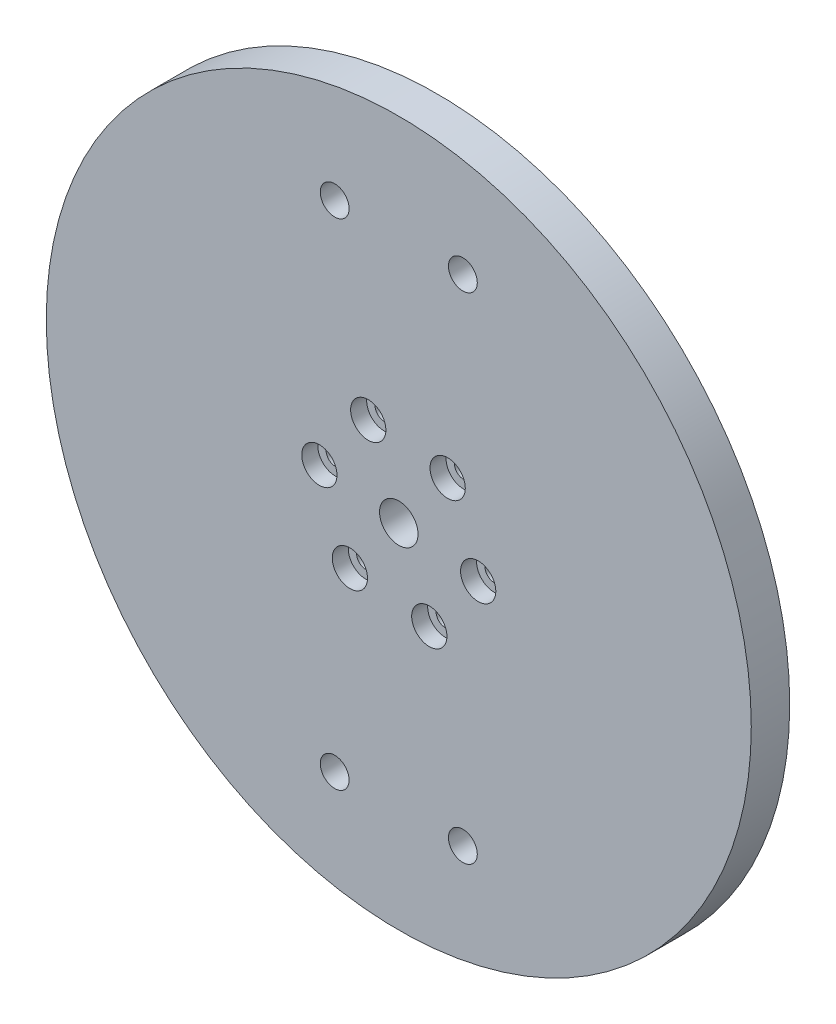
ISO-10303-21;
HEADER;
FILE_DESCRIPTION(('STEP AP214'),'2;1');
FILE_NAME('part.step','',(''),(''),'','','');
FILE_SCHEMA(('AUTOMOTIVE_DESIGN { 1 0 10303 214 1 1 1 1 }'));
ENDSEC;
DATA;
#1=APPLICATION_CONTEXT('core data for automotive mechanical design processes');
#2=APPLICATION_PROTOCOL_DEFINITION('international standard','automotive_design',2000,#1);
#3=PRODUCT_CONTEXT('',#1,'mechanical');
#4=PRODUCT('Part','Part','',(#3));
#5=PRODUCT_RELATED_PRODUCT_CATEGORY('part','',(#4));
#6=PRODUCT_DEFINITION_FORMATION('','',#4);
#7=PRODUCT_DEFINITION_CONTEXT('part definition',#1,'design');
#8=PRODUCT_DEFINITION('design','',#6,#7);
#9=PRODUCT_DEFINITION_SHAPE('','',#8);
#10=(LENGTH_UNIT() NAMED_UNIT(*) SI_UNIT(.MILLI.,.METRE.));
#11=(NAMED_UNIT(*) PLANE_ANGLE_UNIT() SI_UNIT($,.RADIAN.));
#12=(NAMED_UNIT(*) SI_UNIT($,.STERADIAN.) SOLID_ANGLE_UNIT());
#13=UNCERTAINTY_MEASURE_WITH_UNIT(LENGTH_MEASURE(1.E-05),#10,'distance_accuracy_value','');
#14=(GEOMETRIC_REPRESENTATION_CONTEXT(3) GLOBAL_UNCERTAINTY_ASSIGNED_CONTEXT((#13)) GLOBAL_UNIT_ASSIGNED_CONTEXT((#10,
#11,#12)) REPRESENTATION_CONTEXT('',''));
#15=CARTESIAN_POINT('',(0.,0.,0.));
#16=DIRECTION('',(0.,0.,1.));
#17=DIRECTION('',(1.,0.,0.));
#18=AXIS2_PLACEMENT_3D('',#15,#16,#17);
#19=CARTESIAN_POINT('',(7.62681454876585,9.90362054193988,426.));
#20=DIRECTION('',(0.,0.,-1.));
#21=DIRECTION('',(-1.,0.,0.));
#22=AXIS2_PLACEMENT_3D('',#19,#20,#21);
#23=CYLINDRICAL_SURFACE('',#22,1.45);
#24=CARTESIAN_POINT('',(7.62681454876585,9.90362054193988,420.));
#25=DIRECTION('',(0.,0.,1.));
#26=DIRECTION('',(1.,0.,0.));
#27=AXIS2_PLACEMENT_3D('',#24,#25,#26);
#28=CIRCLE('',#27,1.45);
#29=CARTESIAN_POINT('',(9.07681454876585,9.90362054193988,420.));
#30=VERTEX_POINT('',#29);
#31=EDGE_CURVE('E104',#30,#30,#28,.T.);
#32=ORIENTED_EDGE('',*,*,#31,.F.);
#33=EDGE_LOOP('',(#32));
#34=FACE_BOUND('',#33,.T.);
#35=CARTESIAN_POINT('',(7.62681454876585,9.90362054193988,423.5));
#36=DIRECTION('',(0.,0.,1.));
#37=DIRECTION('',(1.,0.,0.));
#38=AXIS2_PLACEMENT_3D('',#35,#36,#37);
#39=CIRCLE('',#38,1.45);
#40=CARTESIAN_POINT('',(9.07681454876585,9.90362054193988,423.5));
#41=VERTEX_POINT('',#40);
#42=EDGE_CURVE('E44',#41,#41,#39,.T.);
#43=ORIENTED_EDGE('',*,*,#42,.T.);
#44=EDGE_LOOP('',(#43));
#45=FACE_BOUND('',#44,.T.);
#46=ADVANCED_FACE('F41',(#34,#45),#23,.F.);
#47=CARTESIAN_POINT('',(-4.76337970437843,11.5568254201539,426.));
#48=DIRECTION('',(0.,0.,-1.));
#49=DIRECTION('',(-1.,0.,0.));
#50=AXIS2_PLACEMENT_3D('',#47,#48,#49);
#51=CYLINDRICAL_SURFACE('',#50,1.45);
#52=CARTESIAN_POINT('',(-4.76337970437843,11.5568254201539,420.));
#53=DIRECTION('',(0.,0.,1.));
#54=DIRECTION('',(1.,0.,0.));
#55=AXIS2_PLACEMENT_3D('',#52,#53,#54);
#56=CIRCLE('',#55,1.45);
#57=CARTESIAN_POINT('',(-3.31337970437843,11.5568254201539,420.));
#58=VERTEX_POINT('',#57);
#59=EDGE_CURVE('E108',#58,#58,#56,.T.);
#60=ORIENTED_EDGE('',*,*,#59,.F.);
#61=EDGE_LOOP('',(#60));
#62=FACE_BOUND('',#61,.T.);
#63=CARTESIAN_POINT('',(-4.76337970437843,11.5568254201539,423.5));
#64=DIRECTION('',(0.,0.,1.));
#65=DIRECTION('',(1.,0.,0.));
#66=AXIS2_PLACEMENT_3D('',#63,#64,#65);
#67=CIRCLE('',#66,1.45);
#68=CARTESIAN_POINT('',(-3.31337970437843,11.5568254201539,423.5));
#69=VERTEX_POINT('',#68);
#70=EDGE_CURVE('E78',#69,#69,#67,.T.);
#71=ORIENTED_EDGE('',*,*,#70,.T.);
#72=EDGE_LOOP('',(#71));
#73=FACE_BOUND('',#72,.T.);
#74=ADVANCED_FACE('F122',(#62,#73),#51,.F.);
#75=CARTESIAN_POINT('',(-12.3901942531443,1.65320487821403,426.));
#76=DIRECTION('',(0.,0.,-1.));
#77=DIRECTION('',(-1.,0.,0.));
#78=AXIS2_PLACEMENT_3D('',#75,#76,#77);
#79=CYLINDRICAL_SURFACE('',#78,1.45);
#80=CARTESIAN_POINT('',(-12.3901942531443,1.65320487821403,420.));
#81=DIRECTION('',(0.,0.,1.));
#82=DIRECTION('',(1.,0.,0.));
#83=AXIS2_PLACEMENT_3D('',#80,#81,#82);
#84=CIRCLE('',#83,1.45);
#85=CARTESIAN_POINT('',(-10.9401942531443,1.65320487821403,420.));
#86=VERTEX_POINT('',#85);
#87=EDGE_CURVE('E101',#86,#86,#84,.T.);
#88=ORIENTED_EDGE('',*,*,#87,.F.);
#89=EDGE_LOOP('',(#88));
#90=FACE_BOUND('',#89,.T.);
#91=CARTESIAN_POINT('',(-12.3901942531443,1.65320487821403,423.5));
#92=DIRECTION('',(0.,0.,1.));
#93=DIRECTION('',(1.,0.,0.));
#94=AXIS2_PLACEMENT_3D('',#91,#92,#93);
#95=CIRCLE('',#94,1.45);
#96=CARTESIAN_POINT('',(-10.9401942531443,1.65320487821403,423.5));
#97=VERTEX_POINT('',#96);
#98=EDGE_CURVE('E79',#97,#97,#95,.T.);
#99=ORIENTED_EDGE('',*,*,#98,.T.);
#100=EDGE_LOOP('',(#99));
#101=FACE_BOUND('',#100,.T.);
#102=ADVANCED_FACE('F118',(#90,#101),#79,.F.);
#103=CARTESIAN_POINT('',(-7.62681454876585,-9.90362054193988,426.));
#104=DIRECTION('',(0.,0.,-1.));
#105=DIRECTION('',(-1.,0.,0.));
#106=AXIS2_PLACEMENT_3D('',#103,#104,#105);
#107=CYLINDRICAL_SURFACE('',#106,1.45);
#108=CARTESIAN_POINT('',(-7.62681454876585,-9.90362054193988,420.));
#109=DIRECTION('',(0.,0.,1.));
#110=DIRECTION('',(1.,0.,0.));
#111=AXIS2_PLACEMENT_3D('',#108,#109,#110);
#112=CIRCLE('',#111,1.45);
#113=CARTESIAN_POINT('',(-6.17681454876585,-9.90362054193988,420.));
#114=VERTEX_POINT('',#113);
#115=EDGE_CURVE('E62',#114,#114,#112,.T.);
#116=ORIENTED_EDGE('',*,*,#115,.F.);
#117=EDGE_LOOP('',(#116));
#118=FACE_BOUND('',#117,.T.);
#119=CARTESIAN_POINT('',(-7.62681454876585,-9.90362054193988,423.5));
#120=DIRECTION('',(0.,0.,1.));
#121=DIRECTION('',(1.,0.,0.));
#122=AXIS2_PLACEMENT_3D('',#119,#120,#121);
#123=CIRCLE('',#122,1.45);
#124=CARTESIAN_POINT('',(-6.17681454876585,-9.90362054193988,423.5));
#125=VERTEX_POINT('',#124);
#126=EDGE_CURVE('E71',#125,#125,#123,.T.);
#127=ORIENTED_EDGE('',*,*,#126,.T.);
#128=EDGE_LOOP('',(#127));
#129=FACE_BOUND('',#128,.T.);
#130=ADVANCED_FACE('F121',(#118,#129),#107,.F.);
#131=CARTESIAN_POINT('',(4.76337970437842,-11.5568254201539,426.));
#132=DIRECTION('',(0.,0.,-1.));
#133=DIRECTION('',(-1.,0.,0.));
#134=AXIS2_PLACEMENT_3D('',#131,#132,#133);
#135=CYLINDRICAL_SURFACE('',#134,1.45);
#136=CARTESIAN_POINT('',(4.76337970437842,-11.5568254201539,420.));
#137=DIRECTION('',(0.,0.,1.));
#138=DIRECTION('',(1.,0.,0.));
#139=AXIS2_PLACEMENT_3D('',#136,#137,#138);
#140=CIRCLE('',#139,1.45);
#141=CARTESIAN_POINT('',(6.21337970437842,-11.5568254201539,420.));
#142=VERTEX_POINT('',#141);
#143=EDGE_CURVE('E86',#142,#142,#140,.T.);
#144=ORIENTED_EDGE('',*,*,#143,.F.);
#145=EDGE_LOOP('',(#144));
#146=FACE_BOUND('',#145,.T.);
#147=CARTESIAN_POINT('',(4.76337970437842,-11.5568254201539,423.5));
#148=DIRECTION('',(0.,0.,1.));
#149=DIRECTION('',(1.,0.,0.));
#150=AXIS2_PLACEMENT_3D('',#147,#148,#149);
#151=CIRCLE('',#150,1.45);
#152=CARTESIAN_POINT('',(6.21337970437842,-11.5568254201539,423.5));
#153=VERTEX_POINT('',#152);
#154=EDGE_CURVE('E66',#153,#153,#151,.T.);
#155=ORIENTED_EDGE('',*,*,#154,.T.);
#156=EDGE_LOOP('',(#155));
#157=FACE_BOUND('',#156,.T.);
#158=ADVANCED_FACE('F201',(#146,#157),#135,.F.);
#159=CARTESIAN_POINT('',(12.3901942531443,-1.65320487821403,426.));
#160=DIRECTION('',(0.,0.,-1.));
#161=DIRECTION('',(-1.,0.,0.));
#162=AXIS2_PLACEMENT_3D('',#159,#160,#161);
#163=CYLINDRICAL_SURFACE('',#162,1.45);
#164=CARTESIAN_POINT('',(12.3901942531443,-1.65320487821403,420.));
#165=DIRECTION('',(0.,0.,1.));
#166=DIRECTION('',(1.,0.,0.));
#167=AXIS2_PLACEMENT_3D('',#164,#165,#166);
#168=CIRCLE('',#167,1.45);
#169=CARTESIAN_POINT('',(13.8401942531443,-1.65320487821403,420.));
#170=VERTEX_POINT('',#169);
#171=EDGE_CURVE('E59',#170,#170,#168,.T.);
#172=ORIENTED_EDGE('',*,*,#171,.F.);
#173=EDGE_LOOP('',(#172));
#174=FACE_BOUND('',#173,.T.);
#175=CARTESIAN_POINT('',(12.3901942531443,-1.65320487821403,423.5));
#176=DIRECTION('',(0.,0.,1.));
#177=DIRECTION('',(1.,0.,0.));
#178=AXIS2_PLACEMENT_3D('',#175,#176,#177);
#179=CIRCLE('',#178,1.45);
#180=CARTESIAN_POINT('',(13.8401942531443,-1.65320487821403,423.5));
#181=VERTEX_POINT('',#180);
#182=EDGE_CURVE('E61',#181,#181,#179,.T.);
#183=ORIENTED_EDGE('',*,*,#182,.T.);
#184=EDGE_LOOP('',(#183));
#185=FACE_BOUND('',#184,.T.);
#186=ADVANCED_FACE('F270',(#174,#185),#163,.F.);
#187=CARTESIAN_POINT('',(0.,0.,426.));
#188=DIRECTION('',(0.,0.,-1.));
#189=DIRECTION('',(-1.,0.,0.));
#190=AXIS2_PLACEMENT_3D('',#187,#188,#189);
#191=CYLINDRICAL_SURFACE('',#190,55.);
#192=CARTESIAN_POINT('',(0.,0.,426.));
#193=DIRECTION('',(0.,0.,1.));
#194=DIRECTION('',(1.,0.,0.));
#195=AXIS2_PLACEMENT_3D('',#192,#193,#194);
#196=CIRCLE('',#195,55.);
#197=CARTESIAN_POINT('',(55.,0.,426.));
#198=VERTEX_POINT('',#197);
#199=EDGE_CURVE('E10',#198,#198,#196,.T.);
#200=ORIENTED_EDGE('',*,*,#199,.F.);
#201=EDGE_LOOP('',(#200));
#202=FACE_BOUND('',#201,.T.);
#203=CARTESIAN_POINT('',(0.,0.,420.));
#204=DIRECTION('',(0.,0.,1.));
#205=DIRECTION('',(1.,0.,0.));
#206=AXIS2_PLACEMENT_3D('',#203,#204,#205);
#207=CIRCLE('',#206,55.);
#208=CARTESIAN_POINT('',(55.,0.,420.));
#209=VERTEX_POINT('',#208);
#210=EDGE_CURVE('E49',#209,#209,#207,.T.);
#211=ORIENTED_EDGE('',*,*,#210,.T.);
#212=EDGE_LOOP('',(#211));
#213=FACE_BOUND('',#212,.T.);
#214=ADVANCED_FACE('F43',(#202,#213),#191,.T.);
#215=CARTESIAN_POINT('',(0.,0.,426.));
#216=DIRECTION('',(0.,0.,1.));
#217=DIRECTION('',(1.,0.,0.));
#218=AXIS2_PLACEMENT_3D('',#215,#216,#217);
#219=PLANE('',#218);
#220=CARTESIAN_POINT('',(-10.,38.61,426.));
#221=DIRECTION('',(0.,0.,1.));
#222=DIRECTION('',(1.,0.,0.));
#223=AXIS2_PLACEMENT_3D('',#220,#221,#222);
#224=CIRCLE('',#223,2.25);
#225=CARTESIAN_POINT('',(-7.75,38.61,426.));
#226=VERTEX_POINT('',#225);
#227=EDGE_CURVE('E522',#226,#226,#224,.T.);
#228=ORIENTED_EDGE('',*,*,#227,.F.);
#229=EDGE_LOOP('',(#228));
#230=FACE_BOUND('',#229,.T.);
#231=CARTESIAN_POINT('',(10.,-38.61,426.));
#232=DIRECTION('',(0.,0.,1.));
#233=DIRECTION('',(1.,0.,0.));
#234=AXIS2_PLACEMENT_3D('',#231,#232,#233);
#235=CIRCLE('',#234,2.25);
#236=CARTESIAN_POINT('',(12.25,-38.61,426.));
#237=VERTEX_POINT('',#236);
#238=EDGE_CURVE('E286',#237,#237,#235,.T.);
#239=ORIENTED_EDGE('',*,*,#238,.F.);
#240=EDGE_LOOP('',(#239));
#241=FACE_BOUND('',#240,.T.);
#242=CARTESIAN_POINT('',(10.,38.61,426.));
#243=DIRECTION('',(0.,0.,1.));
#244=DIRECTION('',(1.,0.,0.));
#245=AXIS2_PLACEMENT_3D('',#242,#243,#244);
#246=CIRCLE('',#245,2.25);
#247=CARTESIAN_POINT('',(12.25,38.61,426.));
#248=VERTEX_POINT('',#247);
#249=EDGE_CURVE('E530',#248,#248,#246,.T.);
#250=ORIENTED_EDGE('',*,*,#249,.F.);
#251=EDGE_LOOP('',(#250));
#252=FACE_BOUND('',#251,.T.);
#253=CARTESIAN_POINT('',(-10.,-38.61,426.));
#254=DIRECTION('',(0.,0.,1.));
#255=DIRECTION('',(1.,0.,0.));
#256=AXIS2_PLACEMENT_3D('',#253,#254,#255);
#257=CIRCLE('',#256,2.25);
#258=CARTESIAN_POINT('',(-7.75,-38.61,426.));
#259=VERTEX_POINT('',#258);
#260=EDGE_CURVE('E279',#259,#259,#257,.T.);
#261=ORIENTED_EDGE('',*,*,#260,.F.);
#262=EDGE_LOOP('',(#261));
#263=FACE_BOUND('',#262,.T.);
#264=CARTESIAN_POINT('',(0.,0.,426.));
#265=DIRECTION('',(0.,0.,1.));
#266=DIRECTION('',(1.,0.,0.));
#267=AXIS2_PLACEMENT_3D('',#264,#265,#266);
#268=CIRCLE('',#267,3.);
#269=CARTESIAN_POINT('',(3.,0.,426.));
#270=VERTEX_POINT('',#269);
#271=EDGE_CURVE('E281',#270,#270,#268,.T.);
#272=ORIENTED_EDGE('',*,*,#271,.F.);
#273=EDGE_LOOP('',(#272));
#274=FACE_BOUND('',#273,.T.);
#275=CARTESIAN_POINT('',(7.62681454876585,9.90362054193988,426.));
#276=DIRECTION('',(0.,0.,1.));
#277=DIRECTION('',(1.,0.,0.));
#278=AXIS2_PLACEMENT_3D('',#275,#276,#277);
#279=CIRCLE('',#278,2.75);
#280=CARTESIAN_POINT('',(10.3768145487658,9.90362054193988,426.));
#281=VERTEX_POINT('',#280);
#282=EDGE_CURVE('E170',#281,#281,#279,.T.);
#283=ORIENTED_EDGE('',*,*,#282,.F.);
#284=EDGE_LOOP('',(#283));
#285=FACE_BOUND('',#284,.T.);
#286=CARTESIAN_POINT('',(-4.76337970437843,11.5568254201539,426.));
#287=DIRECTION('',(0.,0.,1.));
#288=DIRECTION('',(1.,0.,0.));
#289=AXIS2_PLACEMENT_3D('',#286,#287,#288);
#290=CIRCLE('',#289,2.75);
#291=CARTESIAN_POINT('',(-2.01337970437843,11.5568254201539,426.));
#292=VERTEX_POINT('',#291);
#293=EDGE_CURVE('E137',#292,#292,#290,.T.);
#294=ORIENTED_EDGE('',*,*,#293,.F.);
#295=EDGE_LOOP('',(#294));
#296=FACE_BOUND('',#295,.T.);
#297=CARTESIAN_POINT('',(-12.3901942531443,1.65320487821403,426.));
#298=DIRECTION('',(0.,0.,1.));
#299=DIRECTION('',(1.,0.,0.));
#300=AXIS2_PLACEMENT_3D('',#297,#298,#299);
#301=CIRCLE('',#300,2.75);
#302=CARTESIAN_POINT('',(-9.64019425314427,1.65320487821403,426.));
#303=VERTEX_POINT('',#302);
#304=EDGE_CURVE('E139',#303,#303,#301,.T.);
#305=ORIENTED_EDGE('',*,*,#304,.F.);
#306=EDGE_LOOP('',(#305));
#307=FACE_BOUND('',#306,.T.);
#308=CARTESIAN_POINT('',(-7.62681454876585,-9.90362054193988,426.));
#309=DIRECTION('',(0.,0.,1.));
#310=DIRECTION('',(1.,0.,0.));
#311=AXIS2_PLACEMENT_3D('',#308,#309,#310);
#312=CIRCLE('',#311,2.75);
#313=CARTESIAN_POINT('',(-4.87681454876585,-9.90362054193988,426.));
#314=VERTEX_POINT('',#313);
#315=EDGE_CURVE('E152',#314,#314,#312,.T.);
#316=ORIENTED_EDGE('',*,*,#315,.F.);
#317=EDGE_LOOP('',(#316));
#318=FACE_BOUND('',#317,.T.);
#319=CARTESIAN_POINT('',(4.76337970437842,-11.5568254201539,426.));
#320=DIRECTION('',(0.,0.,1.));
#321=DIRECTION('',(1.,0.,0.));
#322=AXIS2_PLACEMENT_3D('',#319,#320,#321);
#323=CIRCLE('',#322,2.75);
#324=CARTESIAN_POINT('',(7.51337970437842,-11.5568254201539,426.));
#325=VERTEX_POINT('',#324);
#326=EDGE_CURVE('E178',#325,#325,#323,.T.);
#327=ORIENTED_EDGE('',*,*,#326,.F.);
#328=EDGE_LOOP('',(#327));
#329=FACE_BOUND('',#328,.T.);
#330=CARTESIAN_POINT('',(12.3901942531443,-1.65320487821403,426.));
#331=DIRECTION('',(0.,0.,1.));
#332=DIRECTION('',(1.,0.,0.));
#333=AXIS2_PLACEMENT_3D('',#330,#331,#332);
#334=CIRCLE('',#333,2.75);
#335=CARTESIAN_POINT('',(15.1401942531443,-1.65320487821403,426.));
#336=VERTEX_POINT('',#335);
#337=EDGE_CURVE('E67',#336,#336,#334,.T.);
#338=ORIENTED_EDGE('',*,*,#337,.F.);
#339=EDGE_LOOP('',(#338));
#340=FACE_BOUND('',#339,.T.);
#341=ORIENTED_EDGE('',*,*,#199,.T.);
#342=EDGE_LOOP('',(#341));
#343=FACE_BOUND('',#342,.T.);
#344=ADVANCED_FACE('F207',(#230,#241,#252,#263,#274,#285,#296,#307,#318,#329,#340,#343),#219,.T.);
#345=CARTESIAN_POINT('',(0.,0.,420.));
#346=DIRECTION('',(0.,0.,1.));
#347=DIRECTION('',(1.,0.,0.));
#348=AXIS2_PLACEMENT_3D('',#345,#346,#347);
#349=PLANE('',#348);
#350=CARTESIAN_POINT('',(-10.,38.61,420.));
#351=DIRECTION('',(0.,0.,1.));
#352=DIRECTION('',(1.,0.,0.));
#353=AXIS2_PLACEMENT_3D('',#350,#351,#352);
#354=CIRCLE('',#353,2.25);
#355=CARTESIAN_POINT('',(-7.75,38.61,420.));
#356=VERTEX_POINT('',#355);
#357=EDGE_CURVE('E224',#356,#356,#354,.T.);
#358=ORIENTED_EDGE('',*,*,#357,.T.);
#359=EDGE_LOOP('',(#358));
#360=FACE_BOUND('',#359,.T.);
#361=CARTESIAN_POINT('',(10.,-38.61,420.));
#362=DIRECTION('',(0.,0.,1.));
#363=DIRECTION('',(1.,0.,0.));
#364=AXIS2_PLACEMENT_3D('',#361,#362,#363);
#365=CIRCLE('',#364,2.25);
#366=CARTESIAN_POINT('',(12.25,-38.61,420.));
#367=VERTEX_POINT('',#366);
#368=EDGE_CURVE('E229',#367,#367,#365,.T.);
#369=ORIENTED_EDGE('',*,*,#368,.T.);
#370=EDGE_LOOP('',(#369));
#371=FACE_BOUND('',#370,.T.);
#372=CARTESIAN_POINT('',(10.,38.61,420.));
#373=DIRECTION('',(0.,0.,1.));
#374=DIRECTION('',(1.,0.,0.));
#375=AXIS2_PLACEMENT_3D('',#372,#373,#374);
#376=CIRCLE('',#375,2.25);
#377=CARTESIAN_POINT('',(12.25,38.61,420.));
#378=VERTEX_POINT('',#377);
#379=EDGE_CURVE('E233',#378,#378,#376,.T.);
#380=ORIENTED_EDGE('',*,*,#379,.T.);
#381=EDGE_LOOP('',(#380));
#382=FACE_BOUND('',#381,.T.);
#383=CARTESIAN_POINT('',(-10.,-38.61,420.));
#384=DIRECTION('',(0.,0.,1.));
#385=DIRECTION('',(1.,0.,0.));
#386=AXIS2_PLACEMENT_3D('',#383,#384,#385);
#387=CIRCLE('',#386,2.25);
#388=CARTESIAN_POINT('',(-7.75,-38.61,420.));
#389=VERTEX_POINT('',#388);
#390=EDGE_CURVE('E234',#389,#389,#387,.T.);
#391=ORIENTED_EDGE('',*,*,#390,.T.);
#392=EDGE_LOOP('',(#391));
#393=FACE_BOUND('',#392,.T.);
#394=CARTESIAN_POINT('',(0.,0.,420.));
#395=DIRECTION('',(0.,0.,1.));
#396=DIRECTION('',(1.,0.,0.));
#397=AXIS2_PLACEMENT_3D('',#394,#395,#396);
#398=CIRCLE('',#397,3.);
#399=CARTESIAN_POINT('',(3.,0.,420.));
#400=VERTEX_POINT('',#399);
#401=EDGE_CURVE('E239',#400,#400,#398,.T.);
#402=ORIENTED_EDGE('',*,*,#401,.T.);
#403=EDGE_LOOP('',(#402));
#404=FACE_BOUND('',#403,.T.);
#405=ORIENTED_EDGE('',*,*,#171,.T.);
#406=EDGE_LOOP('',(#405));
#407=FACE_BOUND('',#406,.T.);
#408=ORIENTED_EDGE('',*,*,#143,.T.);
#409=EDGE_LOOP('',(#408));
#410=FACE_BOUND('',#409,.T.);
#411=ORIENTED_EDGE('',*,*,#115,.T.);
#412=EDGE_LOOP('',(#411));
#413=FACE_BOUND('',#412,.T.);
#414=ORIENTED_EDGE('',*,*,#87,.T.);
#415=EDGE_LOOP('',(#414));
#416=FACE_BOUND('',#415,.T.);
#417=ORIENTED_EDGE('',*,*,#59,.T.);
#418=EDGE_LOOP('',(#417));
#419=FACE_BOUND('',#418,.T.);
#420=ORIENTED_EDGE('',*,*,#31,.T.);
#421=EDGE_LOOP('',(#420));
#422=FACE_BOUND('',#421,.T.);
#423=ORIENTED_EDGE('',*,*,#210,.F.);
#424=EDGE_LOOP('',(#423));
#425=FACE_BOUND('',#424,.T.);
#426=ADVANCED_FACE('F119',(#360,#371,#382,#393,#404,#407,#410,#413,#416,#419,#422,#425),#349,.F.);
#427=CARTESIAN_POINT('',(12.3901942531443,-1.65320487821403,426.));
#428=DIRECTION('',(0.,0.,-1.));
#429=DIRECTION('',(-1.,0.,0.));
#430=AXIS2_PLACEMENT_3D('',#427,#428,#429);
#431=CYLINDRICAL_SURFACE('',#430,2.75);
#432=ORIENTED_EDGE('',*,*,#337,.T.);
#433=EDGE_LOOP('',(#432));
#434=FACE_BOUND('',#433,.T.);
#435=CARTESIAN_POINT('',(12.3901942531443,-1.65320487821403,423.5));
#436=DIRECTION('',(0.,0.,1.));
#437=DIRECTION('',(1.,0.,0.));
#438=AXIS2_PLACEMENT_3D('',#435,#436,#437);
#439=CIRCLE('',#438,2.75);
#440=CARTESIAN_POINT('',(15.1401942531443,-1.65320487821403,423.5));
#441=VERTEX_POINT('',#440);
#442=EDGE_CURVE('E159',#441,#441,#439,.T.);
#443=ORIENTED_EDGE('',*,*,#442,.F.);
#444=EDGE_LOOP('',(#443));
#445=FACE_BOUND('',#444,.T.);
#446=ADVANCED_FACE('F213',(#434,#445),#431,.F.);
#447=CARTESIAN_POINT('',(12.3901942531443,-1.65320487821403,423.5));
#448=DIRECTION('',(0.,0.,1.));
#449=DIRECTION('',(1.,0.,0.));
#450=AXIS2_PLACEMENT_3D('',#447,#448,#449);
#451=PLANE('',#450);
#452=ORIENTED_EDGE('',*,*,#182,.F.);
#453=EDGE_LOOP('',(#452));
#454=FACE_BOUND('',#453,.T.);
#455=ORIENTED_EDGE('',*,*,#442,.T.);
#456=EDGE_LOOP('',(#455));
#457=FACE_BOUND('',#456,.T.);
#458=ADVANCED_FACE('F220',(#454,#457),#451,.T.);
#459=CARTESIAN_POINT('',(4.76337970437842,-11.5568254201539,426.));
#460=DIRECTION('',(0.,0.,-1.));
#461=DIRECTION('',(-1.,0.,0.));
#462=AXIS2_PLACEMENT_3D('',#459,#460,#461);
#463=CYLINDRICAL_SURFACE('',#462,2.75);
#464=ORIENTED_EDGE('',*,*,#326,.T.);
#465=EDGE_LOOP('',(#464));
#466=FACE_BOUND('',#465,.T.);
#467=CARTESIAN_POINT('',(4.76337970437842,-11.5568254201539,423.5));
#468=DIRECTION('',(0.,0.,1.));
#469=DIRECTION('',(1.,0.,0.));
#470=AXIS2_PLACEMENT_3D('',#467,#468,#469);
#471=CIRCLE('',#470,2.75);
#472=CARTESIAN_POINT('',(7.51337970437842,-11.5568254201539,423.5));
#473=VERTEX_POINT('',#472);
#474=EDGE_CURVE('E160',#473,#473,#471,.T.);
#475=ORIENTED_EDGE('',*,*,#474,.F.);
#476=EDGE_LOOP('',(#475));
#477=FACE_BOUND('',#476,.T.);
#478=ADVANCED_FACE('F257',(#466,#477),#463,.F.);
#479=CARTESIAN_POINT('',(4.76337970437842,-11.5568254201539,423.5));
#480=DIRECTION('',(0.,0.,1.));
#481=DIRECTION('',(1.,0.,0.));
#482=AXIS2_PLACEMENT_3D('',#479,#480,#481);
#483=PLANE('',#482);
#484=ORIENTED_EDGE('',*,*,#154,.F.);
#485=EDGE_LOOP('',(#484));
#486=FACE_BOUND('',#485,.T.);
#487=ORIENTED_EDGE('',*,*,#474,.T.);
#488=EDGE_LOOP('',(#487));
#489=FACE_BOUND('',#488,.T.);
#490=ADVANCED_FACE('F254',(#486,#489),#483,.T.);
#491=CARTESIAN_POINT('',(-7.62681454876585,-9.90362054193988,426.));
#492=DIRECTION('',(0.,0.,-1.));
#493=DIRECTION('',(-1.,0.,0.));
#494=AXIS2_PLACEMENT_3D('',#491,#492,#493);
#495=CYLINDRICAL_SURFACE('',#494,2.75);
#496=ORIENTED_EDGE('',*,*,#315,.T.);
#497=EDGE_LOOP('',(#496));
#498=FACE_BOUND('',#497,.T.);
#499=CARTESIAN_POINT('',(-7.62681454876585,-9.90362054193988,423.5));
#500=DIRECTION('',(0.,0.,1.));
#501=DIRECTION('',(1.,0.,0.));
#502=AXIS2_PLACEMENT_3D('',#499,#500,#501);
#503=CIRCLE('',#502,2.75);
#504=CARTESIAN_POINT('',(-4.87681454876585,-9.90362054193988,423.5));
#505=VERTEX_POINT('',#504);
#506=EDGE_CURVE('E146',#505,#505,#503,.T.);
#507=ORIENTED_EDGE('',*,*,#506,.F.);
#508=EDGE_LOOP('',(#507));
#509=FACE_BOUND('',#508,.T.);
#510=ADVANCED_FACE('F249',(#498,#509),#495,.F.);
#511=CARTESIAN_POINT('',(-7.62681454876585,-9.90362054193988,423.5));
#512=DIRECTION('',(0.,0.,1.));
#513=DIRECTION('',(1.,0.,0.));
#514=AXIS2_PLACEMENT_3D('',#511,#512,#513);
#515=PLANE('',#514);
#516=ORIENTED_EDGE('',*,*,#126,.F.);
#517=EDGE_LOOP('',(#516));
#518=FACE_BOUND('',#517,.T.);
#519=ORIENTED_EDGE('',*,*,#506,.T.);
#520=EDGE_LOOP('',(#519));
#521=FACE_BOUND('',#520,.T.);
#522=ADVANCED_FACE('F250',(#518,#521),#515,.T.);
#523=CARTESIAN_POINT('',(-12.3901942531443,1.65320487821403,426.));
#524=DIRECTION('',(0.,0.,-1.));
#525=DIRECTION('',(-1.,0.,0.));
#526=AXIS2_PLACEMENT_3D('',#523,#524,#525);
#527=CYLINDRICAL_SURFACE('',#526,2.75);
#528=ORIENTED_EDGE('',*,*,#304,.T.);
#529=EDGE_LOOP('',(#528));
#530=FACE_BOUND('',#529,.T.);
#531=CARTESIAN_POINT('',(-12.3901942531443,1.65320487821403,423.5));
#532=DIRECTION('',(0.,0.,1.));
#533=DIRECTION('',(1.,0.,0.));
#534=AXIS2_PLACEMENT_3D('',#531,#532,#533);
#535=CIRCLE('',#534,2.75);
#536=CARTESIAN_POINT('',(-9.64019425314427,1.65320487821403,423.5));
#537=VERTEX_POINT('',#536);
#538=EDGE_CURVE('E138',#537,#537,#535,.T.);
#539=ORIENTED_EDGE('',*,*,#538,.F.);
#540=EDGE_LOOP('',(#539));
#541=FACE_BOUND('',#540,.T.);
#542=ADVANCED_FACE('F134',(#530,#541),#527,.F.);
#543=CARTESIAN_POINT('',(-12.3901942531443,1.65320487821403,423.5));
#544=DIRECTION('',(0.,0.,1.));
#545=DIRECTION('',(1.,0.,0.));
#546=AXIS2_PLACEMENT_3D('',#543,#544,#545);
#547=PLANE('',#546);
#548=ORIENTED_EDGE('',*,*,#98,.F.);
#549=EDGE_LOOP('',(#548));
#550=FACE_BOUND('',#549,.T.);
#551=ORIENTED_EDGE('',*,*,#538,.T.);
#552=EDGE_LOOP('',(#551));
#553=FACE_BOUND('',#552,.T.);
#554=ADVANCED_FACE('F126',(#550,#553),#547,.T.);
#555=CARTESIAN_POINT('',(-4.76337970437843,11.5568254201539,426.));
#556=DIRECTION('',(0.,0.,-1.));
#557=DIRECTION('',(-1.,0.,0.));
#558=AXIS2_PLACEMENT_3D('',#555,#556,#557);
#559=CYLINDRICAL_SURFACE('',#558,2.75);
#560=ORIENTED_EDGE('',*,*,#293,.T.);
#561=EDGE_LOOP('',(#560));
#562=FACE_BOUND('',#561,.T.);
#563=CARTESIAN_POINT('',(-4.76337970437843,11.5568254201539,423.5));
#564=DIRECTION('',(0.,0.,1.));
#565=DIRECTION('',(1.,0.,0.));
#566=AXIS2_PLACEMENT_3D('',#563,#564,#565);
#567=CIRCLE('',#566,2.75);
#568=CARTESIAN_POINT('',(-2.01337970437843,11.5568254201539,423.5));
#569=VERTEX_POINT('',#568);
#570=EDGE_CURVE('E145',#569,#569,#567,.T.);
#571=ORIENTED_EDGE('',*,*,#570,.F.);
#572=EDGE_LOOP('',(#571));
#573=FACE_BOUND('',#572,.T.);
#574=ADVANCED_FACE('F132',(#562,#573),#559,.F.);
#575=CARTESIAN_POINT('',(-4.76337970437843,11.5568254201539,423.5));
#576=DIRECTION('',(0.,0.,1.));
#577=DIRECTION('',(1.,0.,0.));
#578=AXIS2_PLACEMENT_3D('',#575,#576,#577);
#579=PLANE('',#578);
#580=ORIENTED_EDGE('',*,*,#70,.F.);
#581=EDGE_LOOP('',(#580));
#582=FACE_BOUND('',#581,.T.);
#583=ORIENTED_EDGE('',*,*,#570,.T.);
#584=EDGE_LOOP('',(#583));
#585=FACE_BOUND('',#584,.T.);
#586=ADVANCED_FACE('F181',(#582,#585),#579,.T.);
#587=CARTESIAN_POINT('',(7.62681454876585,9.90362054193988,426.));
#588=DIRECTION('',(0.,0.,-1.));
#589=DIRECTION('',(-1.,0.,0.));
#590=AXIS2_PLACEMENT_3D('',#587,#588,#589);
#591=CYLINDRICAL_SURFACE('',#590,2.75);
#592=ORIENTED_EDGE('',*,*,#282,.T.);
#593=EDGE_LOOP('',(#592));
#594=FACE_BOUND('',#593,.T.);
#595=CARTESIAN_POINT('',(7.62681454876585,9.90362054193988,423.5));
#596=DIRECTION('',(0.,0.,1.));
#597=DIRECTION('',(1.,0.,0.));
#598=AXIS2_PLACEMENT_3D('',#595,#596,#597);
#599=CIRCLE('',#598,2.75);
#600=CARTESIAN_POINT('',(10.3768145487658,9.90362054193988,423.5));
#601=VERTEX_POINT('',#600);
#602=EDGE_CURVE('E165',#601,#601,#599,.T.);
#603=ORIENTED_EDGE('',*,*,#602,.F.);
#604=EDGE_LOOP('',(#603));
#605=FACE_BOUND('',#604,.T.);
#606=ADVANCED_FACE('F188',(#594,#605),#591,.F.);
#607=CARTESIAN_POINT('',(7.62681454876585,9.90362054193988,423.5));
#608=DIRECTION('',(0.,0.,1.));
#609=DIRECTION('',(1.,0.,0.));
#610=AXIS2_PLACEMENT_3D('',#607,#608,#609);
#611=PLANE('',#610);
#612=ORIENTED_EDGE('',*,*,#42,.F.);
#613=EDGE_LOOP('',(#612));
#614=FACE_BOUND('',#613,.T.);
#615=ORIENTED_EDGE('',*,*,#602,.T.);
#616=EDGE_LOOP('',(#615));
#617=FACE_BOUND('',#616,.T.);
#618=ADVANCED_FACE('F315',(#614,#617),#611,.T.);
#619=CARTESIAN_POINT('',(0.,0.,426.));
#620=DIRECTION('',(0.,0.,-1.));
#621=DIRECTION('',(-1.,0.,0.));
#622=AXIS2_PLACEMENT_3D('',#619,#620,#621);
#623=CYLINDRICAL_SURFACE('',#622,3.);
#624=ORIENTED_EDGE('',*,*,#271,.T.);
#625=EDGE_LOOP('',(#624));
#626=FACE_BOUND('',#625,.T.);
#627=ORIENTED_EDGE('',*,*,#401,.F.);
#628=EDGE_LOOP('',(#627));
#629=FACE_BOUND('',#628,.T.);
#630=ADVANCED_FACE('F306',(#626,#629),#623,.F.);
#631=CARTESIAN_POINT('',(-10.,-38.61,426.));
#632=DIRECTION('',(0.,0.,-1.));
#633=DIRECTION('',(-1.,0.,0.));
#634=AXIS2_PLACEMENT_3D('',#631,#632,#633);
#635=CYLINDRICAL_SURFACE('',#634,2.25);
#636=ORIENTED_EDGE('',*,*,#260,.T.);
#637=EDGE_LOOP('',(#636));
#638=FACE_BOUND('',#637,.T.);
#639=ORIENTED_EDGE('',*,*,#390,.F.);
#640=EDGE_LOOP('',(#639));
#641=FACE_BOUND('',#640,.T.);
#642=ADVANCED_FACE('F318',(#638,#641),#635,.F.);
#643=CARTESIAN_POINT('',(10.,38.61,426.));
#644=DIRECTION('',(0.,0.,-1.));
#645=DIRECTION('',(-1.,0.,0.));
#646=AXIS2_PLACEMENT_3D('',#643,#644,#645);
#647=CYLINDRICAL_SURFACE('',#646,2.25);
#648=ORIENTED_EDGE('',*,*,#249,.T.);
#649=EDGE_LOOP('',(#648));
#650=FACE_BOUND('',#649,.T.);
#651=ORIENTED_EDGE('',*,*,#379,.F.);
#652=EDGE_LOOP('',(#651));
#653=FACE_BOUND('',#652,.T.);
#654=ADVANCED_FACE('F325',(#650,#653),#647,.F.);
#655=CARTESIAN_POINT('',(10.,-38.61,426.));
#656=DIRECTION('',(0.,0.,-1.));
#657=DIRECTION('',(-1.,0.,0.));
#658=AXIS2_PLACEMENT_3D('',#655,#656,#657);
#659=CYLINDRICAL_SURFACE('',#658,2.25);
#660=ORIENTED_EDGE('',*,*,#238,.T.);
#661=EDGE_LOOP('',(#660));
#662=FACE_BOUND('',#661,.T.);
#663=ORIENTED_EDGE('',*,*,#368,.F.);
#664=EDGE_LOOP('',(#663));
#665=FACE_BOUND('',#664,.T.);
#666=ADVANCED_FACE('F400',(#662,#665),#659,.F.);
#667=CARTESIAN_POINT('',(-10.,38.61,426.));
#668=DIRECTION('',(0.,0.,-1.));
#669=DIRECTION('',(-1.,0.,0.));
#670=AXIS2_PLACEMENT_3D('',#667,#668,#669);
#671=CYLINDRICAL_SURFACE('',#670,2.25);
#672=ORIENTED_EDGE('',*,*,#227,.T.);
#673=EDGE_LOOP('',(#672));
#674=FACE_BOUND('',#673,.T.);
#675=ORIENTED_EDGE('',*,*,#357,.F.);
#676=EDGE_LOOP('',(#675));
#677=FACE_BOUND('',#676,.T.);
#678=ADVANCED_FACE('F409',(#674,#677),#671,.F.);
#679=CLOSED_SHELL('',(#46,#74,#102,#130,#158,#186,#214,#344,#426,#446,#458,#478,#490,#510,#522,
#542,#554,#574,#586,#606,#618,#630,#642,#654,#666,#678));
#680=MANIFOLD_SOLID_BREP('B2',#679);
#681=ADVANCED_BREP_SHAPE_REPRESENTATION('',(#18,#680),#14);
#682=SHAPE_DEFINITION_REPRESENTATION(#9,#681);
ENDSEC;
END-ISO-10303-21;
